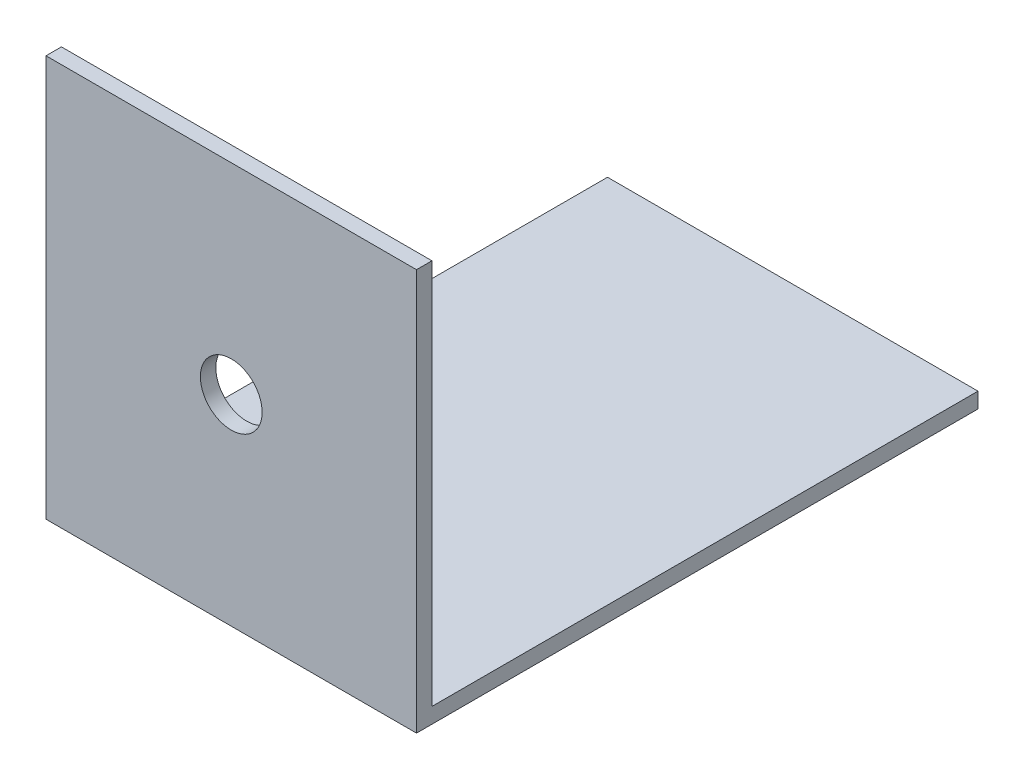
ISO-10303-21;
HEADER;
FILE_DESCRIPTION(('STEP AP214'),'2;1');
FILE_NAME('part.step','',(''),(''),'','','');
FILE_SCHEMA(('AUTOMOTIVE_DESIGN { 1 0 10303 214 1 1 1 1 }'));
ENDSEC;
DATA;
#1=APPLICATION_CONTEXT('core data for automotive mechanical design processes');
#2=APPLICATION_PROTOCOL_DEFINITION('international standard','automotive_design',2000,#1);
#3=PRODUCT_CONTEXT('',#1,'mechanical');
#4=PRODUCT('Part','Part','',(#3));
#5=PRODUCT_RELATED_PRODUCT_CATEGORY('part','',(#4));
#6=PRODUCT_DEFINITION_FORMATION('','',#4);
#7=PRODUCT_DEFINITION_CONTEXT('part definition',#1,'design');
#8=PRODUCT_DEFINITION('design','',#6,#7);
#9=PRODUCT_DEFINITION_SHAPE('','',#8);
#10=(LENGTH_UNIT() NAMED_UNIT(*) SI_UNIT(.MILLI.,.METRE.));
#11=(NAMED_UNIT(*) PLANE_ANGLE_UNIT() SI_UNIT($,.RADIAN.));
#12=(NAMED_UNIT(*) SI_UNIT($,.STERADIAN.) SOLID_ANGLE_UNIT());
#13=UNCERTAINTY_MEASURE_WITH_UNIT(LENGTH_MEASURE(1.E-05),#10,'distance_accuracy_value','');
#14=(GEOMETRIC_REPRESENTATION_CONTEXT(3) GLOBAL_UNCERTAINTY_ASSIGNED_CONTEXT((#13)) GLOBAL_UNIT_ASSIGNED_CONTEXT((#10,
#11,#12)) REPRESENTATION_CONTEXT('',''));
#15=CARTESIAN_POINT('',(0.,0.,0.));
#16=DIRECTION('',(0.,0.,1.));
#17=DIRECTION('',(1.,0.,0.));
#18=AXIS2_PLACEMENT_3D('',#15,#16,#17);
#19=CARTESIAN_POINT('',(120.,130.,0.));
#20=DIRECTION('',(0.,0.,-1.));
#21=DIRECTION('',(0.,1.,0.));
#22=AXIS2_PLACEMENT_3D('',#19,#20,#21);
#23=PLANE('',#22);
#24=CARTESIAN_POINT('',(60.,65.,0.));
#25=DIRECTION('',(0.,0.,-1.));
#26=DIRECTION('',(0.,1.,0.));
#27=AXIS2_PLACEMENT_3D('',#24,#25,#26);
#28=CIRCLE('',#27,10.);
#29=CARTESIAN_POINT('',(60.,75.,0.));
#30=VERTEX_POINT('',#29);
#31=EDGE_CURVE('E124',#30,#30,#28,.F.);
#32=ORIENTED_EDGE('',*,*,#31,.F.);
#33=EDGE_LOOP('',(#32));
#34=FACE_BOUND('',#33,.T.);
#35=DIRECTION('',(0.,-1.,0.));
#36=VECTOR('',#35,1.);
#37=CARTESIAN_POINT('',(0.,130.,0.));
#38=LINE('',#37,#36);
#39=CARTESIAN_POINT('',(0.,130.,0.));
#40=VERTEX_POINT('',#39);
#41=CARTESIAN_POINT('',(0.,0.,0.));
#42=VERTEX_POINT('',#41);
#43=EDGE_CURVE('E120',#40,#42,#38,.T.);
#44=ORIENTED_EDGE('',*,*,#43,.T.);
#45=DIRECTION('',(-1.,0.,0.));
#46=VECTOR('',#45,1.);
#47=CARTESIAN_POINT('',(120.,0.,0.));
#48=LINE('',#47,#46);
#49=CARTESIAN_POINT('',(120.,0.,0.));
#50=VERTEX_POINT('',#49);
#51=EDGE_CURVE('E11',#50,#42,#48,.T.);
#52=ORIENTED_EDGE('',*,*,#51,.F.);
#53=DIRECTION('',(0.,-1.,0.));
#54=VECTOR('',#53,1.);
#55=CARTESIAN_POINT('',(120.,130.,0.));
#56=LINE('',#55,#54);
#57=CARTESIAN_POINT('',(120.,130.,0.));
#58=VERTEX_POINT('',#57);
#59=EDGE_CURVE('E131',#58,#50,#56,.T.);
#60=ORIENTED_EDGE('',*,*,#59,.F.);
#61=DIRECTION('',(-1.,0.,0.));
#62=VECTOR('',#61,1.);
#63=CARTESIAN_POINT('',(120.,130.,0.));
#64=LINE('',#63,#62);
#65=EDGE_CURVE('E116',#58,#40,#64,.T.);
#66=ORIENTED_EDGE('',*,*,#65,.T.);
#67=EDGE_LOOP('',(#44,#52,#60,#66));
#68=FACE_BOUND('',#67,.T.);
#69=ADVANCED_FACE('F35',(#34,#68),#23,.F.);
#70=CARTESIAN_POINT('',(120.,0.,0.));
#71=DIRECTION('',(0.,1.,0.));
#72=DIRECTION('',(0.,0.,1.));
#73=AXIS2_PLACEMENT_3D('',#70,#71,#72);
#74=PLANE('',#73);
#75=DIRECTION('',(0.,0.,-1.));
#76=VECTOR('',#75,1.);
#77=CARTESIAN_POINT('',(0.,0.,0.));
#78=LINE('',#77,#76);
#79=CARTESIAN_POINT('',(0.,0.,-181.86));
#80=VERTEX_POINT('',#79);
#81=EDGE_CURVE('E123',#42,#80,#78,.T.);
#82=ORIENTED_EDGE('',*,*,#81,.T.);
#83=DIRECTION('',(-1.,0.,0.));
#84=VECTOR('',#83,1.);
#85=CARTESIAN_POINT('',(120.,0.,-181.86));
#86=LINE('',#85,#84);
#87=CARTESIAN_POINT('',(120.,0.,-181.86));
#88=VERTEX_POINT('',#87);
#89=EDGE_CURVE('E44',#88,#80,#86,.T.);
#90=ORIENTED_EDGE('',*,*,#89,.F.);
#91=DIRECTION('',(0.,0.,-1.));
#92=VECTOR('',#91,1.);
#93=CARTESIAN_POINT('',(120.,0.,0.));
#94=LINE('',#93,#92);
#95=EDGE_CURVE('E89',#50,#88,#94,.T.);
#96=ORIENTED_EDGE('',*,*,#95,.F.);
#97=ORIENTED_EDGE('',*,*,#51,.T.);
#98=EDGE_LOOP('',(#82,#90,#96,#97));
#99=FACE_BOUND('',#98,.T.);
#100=ADVANCED_FACE('F157',(#99),#74,.F.);
#101=CARTESIAN_POINT('',(120.,0.,-181.86));
#102=DIRECTION('',(0.,0.,1.));
#103=DIRECTION('',(1.,0.,0.));
#104=AXIS2_PLACEMENT_3D('',#101,#102,#103);
#105=PLANE('',#104);
#106=DIRECTION('',(0.,1.,0.));
#107=VECTOR('',#106,1.);
#108=CARTESIAN_POINT('',(0.,0.,-181.86));
#109=LINE('',#108,#107);
#110=CARTESIAN_POINT('',(0.,5.,-181.86));
#111=VERTEX_POINT('',#110);
#112=EDGE_CURVE('E126',#80,#111,#109,.T.);
#113=ORIENTED_EDGE('',*,*,#112,.T.);
#114=DIRECTION('',(-1.,0.,0.));
#115=VECTOR('',#114,1.);
#116=CARTESIAN_POINT('',(120.,5.,-181.86));
#117=LINE('',#116,#115);
#118=CARTESIAN_POINT('',(120.,5.,-181.86));
#119=VERTEX_POINT('',#118);
#120=EDGE_CURVE('E111',#119,#111,#117,.T.);
#121=ORIENTED_EDGE('',*,*,#120,.F.);
#122=DIRECTION('',(0.,1.,0.));
#123=VECTOR('',#122,1.);
#124=CARTESIAN_POINT('',(120.,0.,-181.86));
#125=LINE('',#124,#123);
#126=EDGE_CURVE('E102',#88,#119,#125,.T.);
#127=ORIENTED_EDGE('',*,*,#126,.F.);
#128=ORIENTED_EDGE('',*,*,#89,.T.);
#129=EDGE_LOOP('',(#113,#121,#127,#128));
#130=FACE_BOUND('',#129,.T.);
#131=ADVANCED_FACE('F138',(#130),#105,.F.);
#132=CARTESIAN_POINT('',(120.,5.,-181.86));
#133=DIRECTION('',(0.,-1.,0.));
#134=DIRECTION('',(0.,0.,-1.));
#135=AXIS2_PLACEMENT_3D('',#132,#133,#134);
#136=PLANE('',#135);
#137=DIRECTION('',(0.,0.,1.));
#138=VECTOR('',#137,1.);
#139=CARTESIAN_POINT('',(0.,5.,-181.86));
#140=LINE('',#139,#138);
#141=CARTESIAN_POINT('',(0.,4.99999999999999,-5.));
#142=VERTEX_POINT('',#141);
#143=EDGE_CURVE('E110',#111,#142,#140,.T.);
#144=ORIENTED_EDGE('',*,*,#143,.T.);
#145=DIRECTION('',(-1.,0.,0.));
#146=VECTOR('',#145,1.);
#147=CARTESIAN_POINT('',(120.,4.99999999999999,-5.));
#148=LINE('',#147,#146);
#149=CARTESIAN_POINT('',(120.,4.99999999999999,-5.));
#150=VERTEX_POINT('',#149);
#151=EDGE_CURVE('E107',#150,#142,#148,.T.);
#152=ORIENTED_EDGE('',*,*,#151,.F.);
#153=DIRECTION('',(0.,0.,1.));
#154=VECTOR('',#153,1.);
#155=CARTESIAN_POINT('',(120.,5.,-181.86));
#156=LINE('',#155,#154);
#157=EDGE_CURVE('E96',#119,#150,#156,.T.);
#158=ORIENTED_EDGE('',*,*,#157,.F.);
#159=ORIENTED_EDGE('',*,*,#120,.T.);
#160=EDGE_LOOP('',(#144,#152,#158,#159));
#161=FACE_BOUND('',#160,.T.);
#162=ADVANCED_FACE('F108',(#161),#136,.F.);
#163=CARTESIAN_POINT('',(120.,4.99999999999999,-5.));
#164=DIRECTION('',(0.,0.,1.));
#165=DIRECTION('',(0.,-1.,0.));
#166=AXIS2_PLACEMENT_3D('',#163,#164,#165);
#167=PLANE('',#166);
#168=CARTESIAN_POINT('',(60.,65.,-5.));
#169=DIRECTION('',(0.,0.,1.));
#170=DIRECTION('',(0.,-1.,0.));
#171=AXIS2_PLACEMENT_3D('',#168,#169,#170);
#172=CIRCLE('',#171,10.);
#173=CARTESIAN_POINT('',(60.,55.,-5.));
#174=VERTEX_POINT('',#173);
#175=EDGE_CURVE('E38',#174,#174,#172,.F.);
#176=ORIENTED_EDGE('',*,*,#175,.F.);
#177=EDGE_LOOP('',(#176));
#178=FACE_BOUND('',#177,.T.);
#179=DIRECTION('',(0.,1.,0.));
#180=VECTOR('',#179,1.);
#181=CARTESIAN_POINT('',(0.,4.99999999999999,-5.));
#182=LINE('',#181,#180);
#183=CARTESIAN_POINT('',(0.,130.,-4.99999999999999));
#184=VERTEX_POINT('',#183);
#185=EDGE_CURVE('E75',#142,#184,#182,.T.);
#186=ORIENTED_EDGE('',*,*,#185,.T.);
#187=DIRECTION('',(-1.,0.,0.));
#188=VECTOR('',#187,1.);
#189=CARTESIAN_POINT('',(120.,130.,-4.99999999999999));
#190=LINE('',#189,#188);
#191=CARTESIAN_POINT('',(120.,130.,-4.99999999999999));
#192=VERTEX_POINT('',#191);
#193=EDGE_CURVE('E112',#192,#184,#190,.T.);
#194=ORIENTED_EDGE('',*,*,#193,.F.);
#195=DIRECTION('',(0.,1.,0.));
#196=VECTOR('',#195,1.);
#197=CARTESIAN_POINT('',(120.,4.99999999999999,-5.));
#198=LINE('',#197,#196);
#199=EDGE_CURVE('E100',#150,#192,#198,.T.);
#200=ORIENTED_EDGE('',*,*,#199,.F.);
#201=ORIENTED_EDGE('',*,*,#151,.T.);
#202=EDGE_LOOP('',(#186,#194,#200,#201));
#203=FACE_BOUND('',#202,.T.);
#204=ADVANCED_FACE('F114',(#178,#203),#167,.F.);
#205=CARTESIAN_POINT('',(120.,130.,-4.99999999999999));
#206=DIRECTION('',(0.,-1.,0.));
#207=DIRECTION('',(0.,0.,-1.));
#208=AXIS2_PLACEMENT_3D('',#205,#206,#207);
#209=PLANE('',#208);
#210=DIRECTION('',(0.,0.,1.));
#211=VECTOR('',#210,1.);
#212=CARTESIAN_POINT('',(0.,130.,-4.99999999999999));
#213=LINE('',#212,#211);
#214=EDGE_CURVE('E81',#184,#40,#213,.T.);
#215=ORIENTED_EDGE('',*,*,#214,.T.);
#216=ORIENTED_EDGE('',*,*,#65,.F.);
#217=DIRECTION('',(0.,0.,1.));
#218=VECTOR('',#217,1.);
#219=CARTESIAN_POINT('',(120.,130.,-4.99999999999999));
#220=LINE('',#219,#218);
#221=EDGE_CURVE('E52',#192,#58,#220,.T.);
#222=ORIENTED_EDGE('',*,*,#221,.F.);
#223=ORIENTED_EDGE('',*,*,#193,.T.);
#224=EDGE_LOOP('',(#215,#216,#222,#223));
#225=FACE_BOUND('',#224,.T.);
#226=ADVANCED_FACE('F145',(#225),#209,.F.);
#227=CARTESIAN_POINT('',(120.,0.,0.));
#228=DIRECTION('',(1.,0.,0.));
#229=DIRECTION('',(0.,0.,-1.));
#230=AXIS2_PLACEMENT_3D('',#227,#228,#229);
#231=PLANE('',#230);
#232=ORIENTED_EDGE('',*,*,#59,.T.);
#233=ORIENTED_EDGE('',*,*,#95,.T.);
#234=ORIENTED_EDGE('',*,*,#126,.T.);
#235=ORIENTED_EDGE('',*,*,#157,.T.);
#236=ORIENTED_EDGE('',*,*,#199,.T.);
#237=ORIENTED_EDGE('',*,*,#221,.T.);
#238=EDGE_LOOP('',(#232,#233,#234,#235,#236,#237));
#239=FACE_BOUND('',#238,.T.);
#240=ADVANCED_FACE('F98',(#239),#231,.T.);
#241=CARTESIAN_POINT('',(0.,0.,0.));
#242=DIRECTION('',(1.,0.,0.));
#243=DIRECTION('',(0.,0.,-1.));
#244=AXIS2_PLACEMENT_3D('',#241,#242,#243);
#245=PLANE('',#244);
#246=ORIENTED_EDGE('',*,*,#43,.F.);
#247=ORIENTED_EDGE('',*,*,#214,.F.);
#248=ORIENTED_EDGE('',*,*,#185,.F.);
#249=ORIENTED_EDGE('',*,*,#143,.F.);
#250=ORIENTED_EDGE('',*,*,#112,.F.);
#251=ORIENTED_EDGE('',*,*,#81,.F.);
#252=EDGE_LOOP('',(#246,#247,#248,#249,#250,#251));
#253=FACE_BOUND('',#252,.T.);
#254=ADVANCED_FACE('F141',(#253),#245,.F.);
#255=CARTESIAN_POINT('',(60.,65.,34.));
#256=DIRECTION('',(0.,0.,-1.));
#257=DIRECTION('',(-1.,0.,0.));
#258=AXIS2_PLACEMENT_3D('',#255,#256,#257);
#259=CYLINDRICAL_SURFACE('',#258,10.);
#260=ORIENTED_EDGE('',*,*,#175,.T.);
#261=EDGE_LOOP('',(#260));
#262=FACE_BOUND('',#261,.T.);
#263=ORIENTED_EDGE('',*,*,#31,.T.);
#264=EDGE_LOOP('',(#263));
#265=FACE_BOUND('',#264,.T.);
#266=ADVANCED_FACE('F171',(#262,#265),#259,.F.);
#267=CLOSED_SHELL('',(#69,#100,#131,#162,#204,#226,#240,#254,#266));
#268=MANIFOLD_SOLID_BREP('B2',#267);
#269=ADVANCED_BREP_SHAPE_REPRESENTATION('',(#18,#268),#14);
#270=SHAPE_DEFINITION_REPRESENTATION(#9,#269);
ENDSEC;
END-ISO-10303-21;
